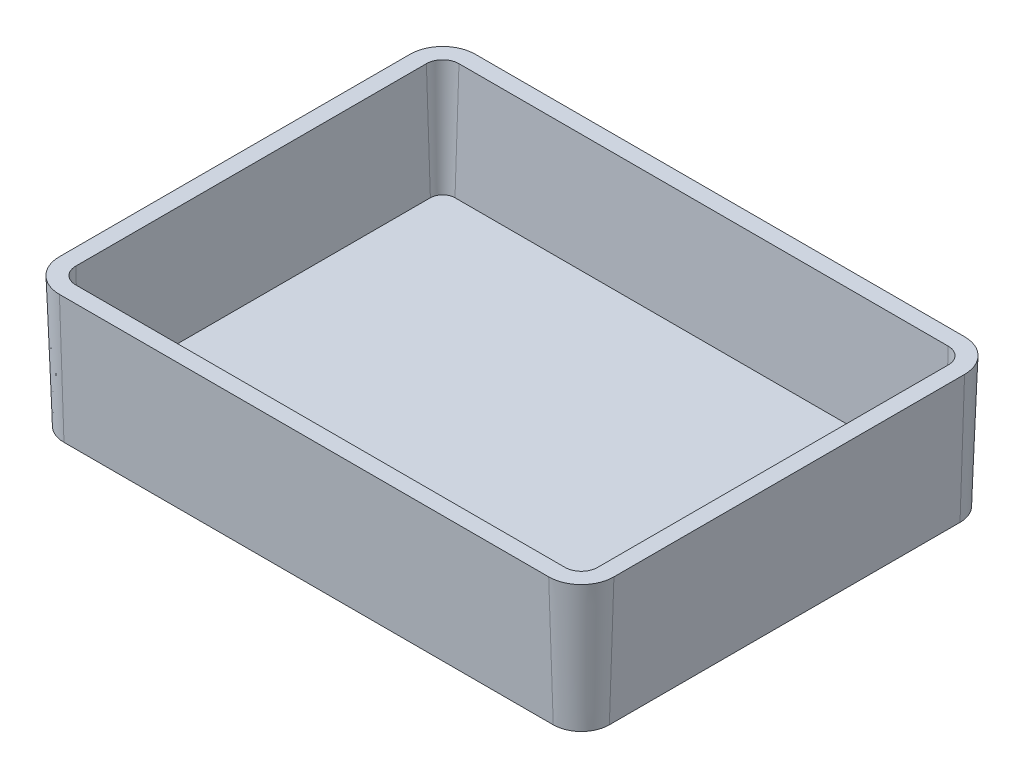
ISO-10303-21;
HEADER;
FILE_DESCRIPTION(('STEP AP214'),'2;1');
FILE_NAME('part.step','',(''),(''),'','','');
FILE_SCHEMA(('AUTOMOTIVE_DESIGN { 1 0 10303 214 1 1 1 1 }'));
ENDSEC;
DATA;
#1=APPLICATION_CONTEXT('core data for automotive mechanical design processes');
#2=APPLICATION_PROTOCOL_DEFINITION('international standard','automotive_design',2000,#1);
#3=PRODUCT_CONTEXT('',#1,'mechanical');
#4=PRODUCT('Part','Part','',(#3));
#5=PRODUCT_RELATED_PRODUCT_CATEGORY('part','',(#4));
#6=PRODUCT_DEFINITION_FORMATION('','',#4);
#7=PRODUCT_DEFINITION_CONTEXT('part definition',#1,'design');
#8=PRODUCT_DEFINITION('design','',#6,#7);
#9=PRODUCT_DEFINITION_SHAPE('','',#8);
#10=(LENGTH_UNIT() NAMED_UNIT(*) SI_UNIT(.MILLI.,.METRE.));
#11=(NAMED_UNIT(*) PLANE_ANGLE_UNIT() SI_UNIT($,.RADIAN.));
#12=(NAMED_UNIT(*) SI_UNIT($,.STERADIAN.) SOLID_ANGLE_UNIT());
#13=UNCERTAINTY_MEASURE_WITH_UNIT(LENGTH_MEASURE(1.E-05),#10,'distance_accuracy_value','');
#14=(GEOMETRIC_REPRESENTATION_CONTEXT(3) GLOBAL_UNCERTAINTY_ASSIGNED_CONTEXT((#13)) GLOBAL_UNIT_ASSIGNED_CONTEXT((#10,
#11,#12)) REPRESENTATION_CONTEXT('',''));
#15=CARTESIAN_POINT('',(0.,0.,0.));
#16=DIRECTION('',(0.,0.,1.));
#17=DIRECTION('',(1.,0.,0.));
#18=AXIS2_PLACEMENT_3D('',#15,#16,#17);
#19=CARTESIAN_POINT('',(-7.5,0.,-5.375));
#20=DIRECTION('',(0.,-1.,0.));
#21=DIRECTION('',(0.,0.,-1.));
#22=AXIS2_PLACEMENT_3D('',#19,#20,#21);
#23=PLANE('',#22);
#24=CARTESIAN_POINT('',(-7.5,0.,-5.375));
#25=DIRECTION('',(0.,1.,0.));
#26=DIRECTION('',(0.,0.,-1.));
#27=AXIS2_PLACEMENT_3D('',#24,#25,#26);
#28=CIRCLE('',#27,1.);
#29=CARTESIAN_POINT('',(-7.5,0.,-6.375));
#30=VERTEX_POINT('',#29);
#31=CARTESIAN_POINT('',(-8.5,0.,-5.37499999999999));
#32=VERTEX_POINT('',#31);
#33=EDGE_CURVE('E175',#30,#32,#28,.T.);
#34=ORIENTED_EDGE('',*,*,#33,.T.);
#35=DIRECTION('',(0.,0.,1.));
#36=VECTOR('',#35,1.);
#37=CARTESIAN_POINT('',(-8.5,0.,5.37499999999999));
#38=LINE('',#37,#36);
#39=CARTESIAN_POINT('',(-8.5,0.,5.37499999999999));
#40=VERTEX_POINT('',#39);
#41=EDGE_CURVE('E240',#32,#40,#38,.T.);
#42=ORIENTED_EDGE('',*,*,#41,.T.);
#43=CARTESIAN_POINT('',(-7.5,0.,5.375));
#44=DIRECTION('',(0.,1.,0.));
#45=DIRECTION('',(0.,0.,-1.));
#46=AXIS2_PLACEMENT_3D('',#43,#44,#45);
#47=CIRCLE('',#46,1.);
#48=CARTESIAN_POINT('',(-7.5,0.,6.375));
#49=VERTEX_POINT('',#48);
#50=EDGE_CURVE('E243',#40,#49,#47,.T.);
#51=ORIENTED_EDGE('',*,*,#50,.T.);
#52=DIRECTION('',(1.,0.,0.));
#53=VECTOR('',#52,1.);
#54=CARTESIAN_POINT('',(-7.5,0.,6.375));
#55=LINE('',#54,#53);
#56=CARTESIAN_POINT('',(7.49999999999999,0.,6.375));
#57=VERTEX_POINT('',#56);
#58=EDGE_CURVE('E246',#49,#57,#55,.T.);
#59=ORIENTED_EDGE('',*,*,#58,.T.);
#60=CARTESIAN_POINT('',(7.5,0.,5.375));
#61=DIRECTION('',(0.,1.,0.));
#62=DIRECTION('',(0.,0.,-1.));
#63=AXIS2_PLACEMENT_3D('',#60,#61,#62);
#64=CIRCLE('',#63,1.);
#65=CARTESIAN_POINT('',(8.5,0.,5.37499999999999));
#66=VERTEX_POINT('',#65);
#67=EDGE_CURVE('E249',#57,#66,#64,.T.);
#68=ORIENTED_EDGE('',*,*,#67,.T.);
#69=DIRECTION('',(0.,0.,-1.));
#70=VECTOR('',#69,1.);
#71=CARTESIAN_POINT('',(8.5,0.,5.37499999999999));
#72=LINE('',#71,#70);
#73=CARTESIAN_POINT('',(8.5,0.,-5.37499999999999));
#74=VERTEX_POINT('',#73);
#75=EDGE_CURVE('E252',#66,#74,#72,.T.);
#76=ORIENTED_EDGE('',*,*,#75,.T.);
#77=CARTESIAN_POINT('',(7.5,0.,-5.375));
#78=DIRECTION('',(0.,1.,0.));
#79=DIRECTION('',(0.,0.,1.));
#80=AXIS2_PLACEMENT_3D('',#77,#78,#79);
#81=CIRCLE('',#80,1.);
#82=CARTESIAN_POINT('',(7.49999999999999,0.,-6.375));
#83=VERTEX_POINT('',#82);
#84=EDGE_CURVE('E255',#74,#83,#81,.T.);
#85=ORIENTED_EDGE('',*,*,#84,.T.);
#86=DIRECTION('',(-1.,0.,0.));
#87=VECTOR('',#86,1.);
#88=CARTESIAN_POINT('',(-7.5,0.,-6.375));
#89=LINE('',#88,#87);
#90=EDGE_CURVE('E257',#83,#30,#89,.T.);
#91=ORIENTED_EDGE('',*,*,#90,.T.);
#92=EDGE_LOOP('',(#34,#42,#51,#59,#68,#76,#85,#91));
#93=FACE_BOUND('',#92,.T.);
#94=CARTESIAN_POINT('',(-7.5,0.,-5.375));
#95=DIRECTION('',(0.,-1.,0.));
#96=DIRECTION('',(0.,0.,-1.));
#97=AXIS2_PLACEMENT_3D('',#94,#95,#96);
#98=CIRCLE('',#97,0.499695227850589);
#99=CARTESIAN_POINT('',(-7.5,0.,-5.87469522785059));
#100=VERTEX_POINT('',#99);
#101=CARTESIAN_POINT('',(-7.99969522785059,0.,-5.375));
#102=VERTEX_POINT('',#101);
#103=EDGE_CURVE('E219',#100,#102,#98,.F.);
#104=ORIENTED_EDGE('',*,*,#103,.F.);
#105=DIRECTION('',(-1.,0.,0.));
#106=VECTOR('',#105,1.);
#107=CARTESIAN_POINT('',(-7.5,0.,-5.87469522785059));
#108=LINE('',#107,#106);
#109=CARTESIAN_POINT('',(7.5,0.,-5.87469522785059));
#110=VERTEX_POINT('',#109);
#111=EDGE_CURVE('E171',#110,#100,#108,.T.);
#112=ORIENTED_EDGE('',*,*,#111,.F.);
#113=CARTESIAN_POINT('',(7.5,0.,-5.375));
#114=DIRECTION('',(0.,-1.,0.));
#115=DIRECTION('',(0.,0.,-1.));
#116=AXIS2_PLACEMENT_3D('',#113,#114,#115);
#117=CIRCLE('',#116,0.499695227850589);
#118=CARTESIAN_POINT('',(7.99969522785059,0.,-5.37499999999999));
#119=VERTEX_POINT('',#118);
#120=EDGE_CURVE('E56',#119,#110,#117,.F.);
#121=ORIENTED_EDGE('',*,*,#120,.F.);
#122=DIRECTION('',(0.,0.,-1.));
#123=VECTOR('',#122,1.);
#124=CARTESIAN_POINT('',(7.99969522785059,0.,5.37499999999999));
#125=LINE('',#124,#123);
#126=CARTESIAN_POINT('',(7.99969522785059,0.,5.375));
#127=VERTEX_POINT('',#126);
#128=EDGE_CURVE('E233',#127,#119,#125,.T.);
#129=ORIENTED_EDGE('',*,*,#128,.F.);
#130=CARTESIAN_POINT('',(7.5,0.,5.375));
#131=DIRECTION('',(0.,-1.,0.));
#132=DIRECTION('',(0.,0.,-1.));
#133=AXIS2_PLACEMENT_3D('',#130,#131,#132);
#134=CIRCLE('',#133,0.499695227850589);
#135=CARTESIAN_POINT('',(7.49999999999999,0.,5.87469522785059));
#136=VERTEX_POINT('',#135);
#137=EDGE_CURVE('E230',#136,#127,#134,.F.);
#138=ORIENTED_EDGE('',*,*,#137,.F.);
#139=DIRECTION('',(1.,0.,0.));
#140=VECTOR('',#139,1.);
#141=CARTESIAN_POINT('',(-7.5,0.,5.87469522785059));
#142=LINE('',#141,#140);
#143=CARTESIAN_POINT('',(-7.5,0.,5.87469522785059));
#144=VERTEX_POINT('',#143);
#145=EDGE_CURVE('E227',#144,#136,#142,.T.);
#146=ORIENTED_EDGE('',*,*,#145,.F.);
#147=CARTESIAN_POINT('',(-7.5,0.,5.375));
#148=DIRECTION('',(0.,-1.,0.));
#149=DIRECTION('',(0.,0.,-1.));
#150=AXIS2_PLACEMENT_3D('',#147,#148,#149);
#151=CIRCLE('',#150,0.499695227850589);
#152=CARTESIAN_POINT('',(-7.99969522785059,0.,5.37499999999999));
#153=VERTEX_POINT('',#152);
#154=EDGE_CURVE('E224',#153,#144,#151,.F.);
#155=ORIENTED_EDGE('',*,*,#154,.F.);
#156=DIRECTION('',(0.,0.,1.));
#157=VECTOR('',#156,1.);
#158=CARTESIAN_POINT('',(-7.99969522785059,0.,5.37499999999999));
#159=LINE('',#158,#157);
#160=EDGE_CURVE('E221',#102,#153,#159,.T.);
#161=ORIENTED_EDGE('',*,*,#160,.F.);
#162=EDGE_LOOP('',(#104,#112,#121,#129,#138,#146,#155,#161));
#163=FACE_BOUND('',#162,.T.);
#164=ADVANCED_FACE('F39',(#93,#163),#23,.F.);
#165=CARTESIAN_POINT('',(-7.5,0.,-5.375));
#166=DIRECTION('',(0.,1.,0.));
#167=DIRECTION('',(0.,0.,-1.));
#168=AXIS2_PLACEMENT_3D('',#165,#166,#167);
#169=CONICAL_SURFACE('',#168,1.,0.0349065850398867);
#170=ORIENTED_EDGE('',*,*,#33,.F.);
#171=DIRECTION('',(0.,0.999390827019096,-0.034899496702501));
#172=VECTOR('',#171,1.);
#173=CARTESIAN_POINT('',(-7.5,0.,-6.375));
#174=LINE('',#173,#172);
#175=CARTESIAN_POINT('',(-7.5,-4.,-6.23531692203301));
#176=VERTEX_POINT('',#175);
#177=EDGE_CURVE('E11',#176,#30,#174,.T.);
#178=ORIENTED_EDGE('',*,*,#177,.F.);
#179=CARTESIAN_POINT('',(-7.5,-4.,-5.375));
#180=DIRECTION('',(0.,-1.,0.));
#181=DIRECTION('',(0.,0.,-1.));
#182=AXIS2_PLACEMENT_3D('',#179,#180,#181);
#183=CIRCLE('',#182,0.860316922033009);
#184=CARTESIAN_POINT('',(-8.36031692203301,-4.,-5.37499999999999));
#185=VERTEX_POINT('',#184);
#186=EDGE_CURVE('E259',#176,#185,#183,.F.);
#187=ORIENTED_EDGE('',*,*,#186,.T.);
#188=DIRECTION('',(-0.034899496702501,0.999390827019096,0.));
#189=VECTOR('',#188,1.);
#190=CARTESIAN_POINT('',(-8.5,0.,-5.37499999999999));
#191=LINE('',#190,#189);
#192=EDGE_CURVE('E91',#185,#32,#191,.T.);
#193=ORIENTED_EDGE('',*,*,#192,.T.);
#194=EDGE_LOOP('',(#170,#178,#187,#193));
#195=FACE_BOUND('',#194,.T.);
#196=ADVANCED_FACE('F296',(#195),#169,.T.);
#197=CARTESIAN_POINT('',(-7.5,0.,-6.375));
#198=DIRECTION('',(0.,-0.034899496702501,-0.999390827019096));
#199=DIRECTION('',(0.,0.999390827019096,-0.034899496702501));
#200=AXIS2_PLACEMENT_3D('',#197,#198,#199);
#201=PLANE('',#200);
#202=ORIENTED_EDGE('',*,*,#90,.F.);
#203=DIRECTION('',(0.,0.999390827019096,-0.034899496702501));
#204=VECTOR('',#203,1.);
#205=CARTESIAN_POINT('',(7.49999999999999,0.,-6.375));
#206=LINE('',#205,#204);
#207=CARTESIAN_POINT('',(7.49999999999999,-4.,-6.23531692203301));
#208=VERTEX_POINT('',#207);
#209=EDGE_CURVE('E48',#208,#83,#206,.T.);
#210=ORIENTED_EDGE('',*,*,#209,.F.);
#211=DIRECTION('',(-1.,0.,0.));
#212=VECTOR('',#211,1.);
#213=CARTESIAN_POINT('',(-7.5,-4.,-6.23531692203301));
#214=LINE('',#213,#212);
#215=EDGE_CURVE('E263',#208,#176,#214,.T.);
#216=ORIENTED_EDGE('',*,*,#215,.T.);
#217=ORIENTED_EDGE('',*,*,#177,.T.);
#218=EDGE_LOOP('',(#202,#210,#216,#217));
#219=FACE_BOUND('',#218,.T.);
#220=ADVANCED_FACE('F41',(#219),#201,.T.);
#221=CARTESIAN_POINT('',(7.5,0.,-5.375));
#222=DIRECTION('',(0.,1.,0.));
#223=DIRECTION('',(0.,0.,1.));
#224=AXIS2_PLACEMENT_3D('',#221,#222,#223);
#225=CONICAL_SURFACE('',#224,1.,0.0349065850398867);
#226=ORIENTED_EDGE('',*,*,#84,.F.);
#227=DIRECTION('',(0.034899496702501,0.999390827019096,0.));
#228=VECTOR('',#227,1.);
#229=CARTESIAN_POINT('',(8.5,0.,-5.37499999999999));
#230=LINE('',#229,#228);
#231=CARTESIAN_POINT('',(8.36031692203301,-4.,-5.37499999999999));
#232=VERTEX_POINT('',#231);
#233=EDGE_CURVE('E271',#232,#74,#230,.T.);
#234=ORIENTED_EDGE('',*,*,#233,.F.);
#235=CARTESIAN_POINT('',(7.5,-4.,-5.375));
#236=DIRECTION('',(0.,-1.,0.));
#237=DIRECTION('',(0.,0.,-1.));
#238=AXIS2_PLACEMENT_3D('',#235,#236,#237);
#239=CIRCLE('',#238,0.860316922033009);
#240=EDGE_CURVE('E276',#232,#208,#239,.F.);
#241=ORIENTED_EDGE('',*,*,#240,.T.);
#242=ORIENTED_EDGE('',*,*,#209,.T.);
#243=EDGE_LOOP('',(#226,#234,#241,#242));
#244=FACE_BOUND('',#243,.T.);
#245=ADVANCED_FACE('F300',(#244),#225,.T.);
#246=CARTESIAN_POINT('',(8.5,0.,5.37499999999999));
#247=DIRECTION('',(0.999390827019096,-0.034899496702501,0.));
#248=DIRECTION('',(0.034899496702501,0.999390827019096,0.));
#249=AXIS2_PLACEMENT_3D('',#246,#247,#248);
#250=PLANE('',#249);
#251=ORIENTED_EDGE('',*,*,#75,.F.);
#252=DIRECTION('',(0.034899496702501,0.999390827019096,0.));
#253=VECTOR('',#252,1.);
#254=CARTESIAN_POINT('',(8.5,0.,5.37499999999999));
#255=LINE('',#254,#253);
#256=CARTESIAN_POINT('',(8.36031692203301,-4.,5.37499999999999));
#257=VERTEX_POINT('',#256);
#258=EDGE_CURVE('E269',#257,#66,#255,.T.);
#259=ORIENTED_EDGE('',*,*,#258,.F.);
#260=DIRECTION('',(0.,0.,-1.));
#261=VECTOR('',#260,1.);
#262=CARTESIAN_POINT('',(8.36031692203301,-4.,5.37499999999999));
#263=LINE('',#262,#261);
#264=EDGE_CURVE('E278',#257,#232,#263,.T.);
#265=ORIENTED_EDGE('',*,*,#264,.T.);
#266=ORIENTED_EDGE('',*,*,#233,.T.);
#267=EDGE_LOOP('',(#251,#259,#265,#266));
#268=FACE_BOUND('',#267,.T.);
#269=ADVANCED_FACE('F305',(#268),#250,.T.);
#270=CARTESIAN_POINT('',(7.5,0.,5.375));
#271=DIRECTION('',(0.,1.,0.));
#272=DIRECTION('',(0.,0.,-1.));
#273=AXIS2_PLACEMENT_3D('',#270,#271,#272);
#274=CONICAL_SURFACE('',#273,1.,0.0349065850398867);
#275=ORIENTED_EDGE('',*,*,#67,.F.);
#276=DIRECTION('',(0.,0.999390827019096,0.034899496702501));
#277=VECTOR('',#276,1.);
#278=CARTESIAN_POINT('',(7.49999999999999,0.,6.375));
#279=LINE('',#278,#277);
#280=CARTESIAN_POINT('',(7.49999999999999,-4.,6.23531692203301));
#281=VERTEX_POINT('',#280);
#282=EDGE_CURVE('E267',#281,#57,#279,.T.);
#283=ORIENTED_EDGE('',*,*,#282,.F.);
#284=CARTESIAN_POINT('',(7.5,-4.,5.375));
#285=DIRECTION('',(0.,-1.,0.));
#286=DIRECTION('',(0.,0.,-1.));
#287=AXIS2_PLACEMENT_3D('',#284,#285,#286);
#288=CIRCLE('',#287,0.860316922033009);
#289=EDGE_CURVE('E281',#281,#257,#288,.F.);
#290=ORIENTED_EDGE('',*,*,#289,.T.);
#291=ORIENTED_EDGE('',*,*,#258,.T.);
#292=EDGE_LOOP('',(#275,#283,#290,#291));
#293=FACE_BOUND('',#292,.T.);
#294=ADVANCED_FACE('F308',(#293),#274,.T.);
#295=CARTESIAN_POINT('',(-7.5,0.,6.375));
#296=DIRECTION('',(0.,-0.034899496702501,0.999390827019096));
#297=DIRECTION('',(0.,-0.999390827019096,-0.034899496702501));
#298=AXIS2_PLACEMENT_3D('',#295,#296,#297);
#299=PLANE('',#298);
#300=ORIENTED_EDGE('',*,*,#58,.F.);
#301=DIRECTION('',(0.,0.999390827019096,0.034899496702501));
#302=VECTOR('',#301,1.);
#303=CARTESIAN_POINT('',(-7.5,0.,6.375));
#304=LINE('',#303,#302);
#305=CARTESIAN_POINT('',(-7.5,-4.,6.23531692203301));
#306=VERTEX_POINT('',#305);
#307=EDGE_CURVE('E265',#306,#49,#304,.T.);
#308=ORIENTED_EDGE('',*,*,#307,.F.);
#309=DIRECTION('',(1.,0.,0.));
#310=VECTOR('',#309,1.);
#311=CARTESIAN_POINT('',(-7.5,-4.,6.23531692203301));
#312=LINE('',#311,#310);
#313=EDGE_CURVE('E284',#306,#281,#312,.T.);
#314=ORIENTED_EDGE('',*,*,#313,.T.);
#315=ORIENTED_EDGE('',*,*,#282,.T.);
#316=EDGE_LOOP('',(#300,#308,#314,#315));
#317=FACE_BOUND('',#316,.T.);
#318=ADVANCED_FACE('F311',(#317),#299,.T.);
#319=CARTESIAN_POINT('',(-7.5,0.,5.375));
#320=DIRECTION('',(0.,1.,0.));
#321=DIRECTION('',(0.,0.,-1.));
#322=AXIS2_PLACEMENT_3D('',#319,#320,#321);
#323=CONICAL_SURFACE('',#322,1.,0.0349065850398867);
#324=ORIENTED_EDGE('',*,*,#50,.F.);
#325=DIRECTION('',(-0.034899496702501,0.999390827019096,0.));
#326=VECTOR('',#325,1.);
#327=CARTESIAN_POINT('',(-8.5,0.,5.37499999999999));
#328=LINE('',#327,#326);
#329=CARTESIAN_POINT('',(-8.36031692203301,-4.,5.37499999999999));
#330=VERTEX_POINT('',#329);
#331=EDGE_CURVE('E262',#330,#40,#328,.T.);
#332=ORIENTED_EDGE('',*,*,#331,.F.);
#333=CARTESIAN_POINT('',(-7.5,-4.,5.375));
#334=DIRECTION('',(0.,-1.,0.));
#335=DIRECTION('',(0.,0.,-1.));
#336=AXIS2_PLACEMENT_3D('',#333,#334,#335);
#337=CIRCLE('',#336,0.860316922033009);
#338=EDGE_CURVE('E286',#330,#306,#337,.F.);
#339=ORIENTED_EDGE('',*,*,#338,.T.);
#340=ORIENTED_EDGE('',*,*,#307,.T.);
#341=EDGE_LOOP('',(#324,#332,#339,#340));
#342=FACE_BOUND('',#341,.T.);
#343=ADVANCED_FACE('F312',(#342),#323,.T.);
#344=CARTESIAN_POINT('',(-8.5,0.,5.37499999999999));
#345=DIRECTION('',(-0.999390827019096,-0.034899496702501,0.));
#346=DIRECTION('',(0.034899496702501,-0.999390827019096,0.));
#347=AXIS2_PLACEMENT_3D('',#344,#345,#346);
#348=PLANE('',#347);
#349=ORIENTED_EDGE('',*,*,#41,.F.);
#350=ORIENTED_EDGE('',*,*,#192,.F.);
#351=DIRECTION('',(0.,0.,1.));
#352=VECTOR('',#351,1.);
#353=CARTESIAN_POINT('',(-8.36031692203301,-4.,5.37499999999999));
#354=LINE('',#353,#352);
#355=EDGE_CURVE('E43',#185,#330,#354,.T.);
#356=ORIENTED_EDGE('',*,*,#355,.T.);
#357=ORIENTED_EDGE('',*,*,#331,.T.);
#358=EDGE_LOOP('',(#349,#350,#356,#357));
#359=FACE_BOUND('',#358,.T.);
#360=ADVANCED_FACE('F290',(#359),#348,.T.);
#361=CARTESIAN_POINT('',(-7.5,-4.,-5.375));
#362=DIRECTION('',(0.,-1.,0.));
#363=DIRECTION('',(0.,0.,-1.));
#364=AXIS2_PLACEMENT_3D('',#361,#362,#363);
#365=PLANE('',#364);
#366=ORIENTED_EDGE('',*,*,#186,.F.);
#367=ORIENTED_EDGE('',*,*,#215,.F.);
#368=ORIENTED_EDGE('',*,*,#240,.F.);
#369=ORIENTED_EDGE('',*,*,#264,.F.);
#370=ORIENTED_EDGE('',*,*,#289,.F.);
#371=ORIENTED_EDGE('',*,*,#313,.F.);
#372=ORIENTED_EDGE('',*,*,#338,.F.);
#373=ORIENTED_EDGE('',*,*,#355,.F.);
#374=EDGE_LOOP('',(#366,#367,#368,#369,#370,#371,#372,#373));
#375=FACE_BOUND('',#374,.T.);
#376=ADVANCED_FACE('F293',(#375),#365,.T.);
#377=CARTESIAN_POINT('',(-7.5,0.0174497483512505,-5.375));
#378=DIRECTION('',(0.,1.,0.));
#379=DIRECTION('',(0.,0.,-1.));
#380=AXIS2_PLACEMENT_3D('',#377,#378,#379);
#381=CONICAL_SURFACE('',#380,0.500304586490452,0.0349065850398867);
#382=ORIENTED_EDGE('',*,*,#103,.T.);
#383=DIRECTION('',(-0.034899496702501,0.999390827019096,0.));
#384=VECTOR('',#383,1.);
#385=CARTESIAN_POINT('',(-8.00030458649045,0.0174497483512505,-5.375));
#386=LINE('',#385,#384);
#387=CARTESIAN_POINT('',(-7.87747253462947,-3.5,-5.375));
#388=VERTEX_POINT('',#387);
#389=EDGE_CURVE('E181',#388,#102,#386,.T.);
#390=ORIENTED_EDGE('',*,*,#389,.F.);
#391=CARTESIAN_POINT('',(-7.5,-3.5,-5.375));
#392=DIRECTION('',(0.,-1.,0.));
#393=DIRECTION('',(0.,0.,-1.));
#394=AXIS2_PLACEMENT_3D('',#391,#392,#393);
#395=CIRCLE('',#394,0.377472534629472);
#396=CARTESIAN_POINT('',(-7.5,-3.5,-5.75247253462947));
#397=VERTEX_POINT('',#396);
#398=EDGE_CURVE('E179',#397,#388,#395,.F.);
#399=ORIENTED_EDGE('',*,*,#398,.F.);
#400=DIRECTION('',(0.,0.999390827019096,-0.034899496702501));
#401=VECTOR('',#400,1.);
#402=CARTESIAN_POINT('',(-7.5,0.0174497483512505,-5.87530458649045));
#403=LINE('',#402,#401);
#404=EDGE_CURVE('E165',#397,#100,#403,.T.);
#405=ORIENTED_EDGE('',*,*,#404,.T.);
#406=EDGE_LOOP('',(#382,#390,#399,#405));
#407=FACE_BOUND('',#406,.T.);
#408=ADVANCED_FACE('F180',(#407),#381,.F.);
#409=CARTESIAN_POINT('',(-7.5,0.0174497483512505,-5.87530458649045));
#410=DIRECTION('',(0.,-0.034899496702501,-0.999390827019096));
#411=DIRECTION('',(0.,0.999390827019096,-0.034899496702501));
#412=AXIS2_PLACEMENT_3D('',#409,#410,#411);
#413=PLANE('',#412);
#414=ORIENTED_EDGE('',*,*,#111,.T.);
#415=ORIENTED_EDGE('',*,*,#404,.F.);
#416=DIRECTION('',(-1.,0.,0.));
#417=VECTOR('',#416,1.);
#418=CARTESIAN_POINT('',(-7.5,-3.5,-5.75247253462947));
#419=LINE('',#418,#417);
#420=CARTESIAN_POINT('',(7.5,-3.5,-5.75247253462947));
#421=VERTEX_POINT('',#420);
#422=EDGE_CURVE('E169',#421,#397,#419,.T.);
#423=ORIENTED_EDGE('',*,*,#422,.F.);
#424=DIRECTION('',(0.,0.999390827019096,-0.034899496702501));
#425=VECTOR('',#424,1.);
#426=CARTESIAN_POINT('',(7.5,0.0174497483512505,-5.87530458649045));
#427=LINE('',#426,#425);
#428=EDGE_CURVE('E176',#421,#110,#427,.T.);
#429=ORIENTED_EDGE('',*,*,#428,.T.);
#430=EDGE_LOOP('',(#414,#415,#423,#429));
#431=FACE_BOUND('',#430,.T.);
#432=ADVANCED_FACE('F167',(#431),#413,.F.);
#433=CARTESIAN_POINT('',(7.5,0.0174497483512505,-5.375));
#434=DIRECTION('',(0.,1.,0.));
#435=DIRECTION('',(0.,0.,1.));
#436=AXIS2_PLACEMENT_3D('',#433,#434,#435);
#437=CONICAL_SURFACE('',#436,0.500304586490452,0.0349065850398867);
#438=ORIENTED_EDGE('',*,*,#120,.T.);
#439=ORIENTED_EDGE('',*,*,#428,.F.);
#440=CARTESIAN_POINT('',(7.5,-3.5,-5.375));
#441=DIRECTION('',(0.,-1.,0.));
#442=DIRECTION('',(0.,0.,-1.));
#443=AXIS2_PLACEMENT_3D('',#440,#441,#442);
#444=CIRCLE('',#443,0.377472534629472);
#445=CARTESIAN_POINT('',(7.87747253462947,-3.5,-5.37499999999999));
#446=VERTEX_POINT('',#445);
#447=EDGE_CURVE('E191',#446,#421,#444,.F.);
#448=ORIENTED_EDGE('',*,*,#447,.F.);
#449=DIRECTION('',(0.034899496702501,0.999390827019096,0.));
#450=VECTOR('',#449,1.);
#451=CARTESIAN_POINT('',(8.00030458649045,0.0174497483512505,-5.37499999999999));
#452=LINE('',#451,#450);
#453=EDGE_CURVE('E199',#446,#119,#452,.T.);
#454=ORIENTED_EDGE('',*,*,#453,.T.);
#455=EDGE_LOOP('',(#438,#439,#448,#454));
#456=FACE_BOUND('',#455,.T.);
#457=ADVANCED_FACE('F351',(#456),#437,.F.);
#458=CARTESIAN_POINT('',(8.00030458649045,0.0174497483512505,5.37499999999999));
#459=DIRECTION('',(0.999390827019096,-0.034899496702501,0.));
#460=DIRECTION('',(0.034899496702501,0.999390827019096,0.));
#461=AXIS2_PLACEMENT_3D('',#458,#459,#460);
#462=PLANE('',#461);
#463=ORIENTED_EDGE('',*,*,#128,.T.);
#464=ORIENTED_EDGE('',*,*,#453,.F.);
#465=DIRECTION('',(0.,0.,-1.));
#466=VECTOR('',#465,1.);
#467=CARTESIAN_POINT('',(7.87747253462947,-3.5,5.37499999999999));
#468=LINE('',#467,#466);
#469=CARTESIAN_POINT('',(7.87747253462947,-3.5,5.375));
#470=VERTEX_POINT('',#469);
#471=EDGE_CURVE('E195',#470,#446,#468,.T.);
#472=ORIENTED_EDGE('',*,*,#471,.F.);
#473=DIRECTION('',(0.034899496702501,0.999390827019096,0.));
#474=VECTOR('',#473,1.);
#475=CARTESIAN_POINT('',(8.00030458649045,0.0174497483512505,5.375));
#476=LINE('',#475,#474);
#477=EDGE_CURVE('E200',#470,#127,#476,.T.);
#478=ORIENTED_EDGE('',*,*,#477,.T.);
#479=EDGE_LOOP('',(#463,#464,#472,#478));
#480=FACE_BOUND('',#479,.T.);
#481=ADVANCED_FACE('F347',(#480),#462,.F.);
#482=CARTESIAN_POINT('',(7.5,0.0174497483512505,5.375));
#483=DIRECTION('',(0.,1.,0.));
#484=DIRECTION('',(0.,0.,-1.));
#485=AXIS2_PLACEMENT_3D('',#482,#483,#484);
#486=CONICAL_SURFACE('',#485,0.500304586490452,0.0349065850398867);
#487=ORIENTED_EDGE('',*,*,#137,.T.);
#488=ORIENTED_EDGE('',*,*,#477,.F.);
#489=CARTESIAN_POINT('',(7.5,-3.5,5.375));
#490=DIRECTION('',(0.,-1.,0.));
#491=DIRECTION('',(0.,0.,-1.));
#492=AXIS2_PLACEMENT_3D('',#489,#490,#491);
#493=CIRCLE('',#492,0.377472534629472);
#494=CARTESIAN_POINT('',(7.49999999999999,-3.5,5.75247253462947));
#495=VERTEX_POINT('',#494);
#496=EDGE_CURVE('E205',#495,#470,#493,.F.);
#497=ORIENTED_EDGE('',*,*,#496,.F.);
#498=DIRECTION('',(0.,-0.999390827019096,-0.034899496702501));
#499=VECTOR('',#498,1.);
#500=CARTESIAN_POINT('',(7.49999999999999,0.0174497483512505,5.87530458649045));
#501=LINE('',#500,#499);
#502=EDGE_CURVE('E203',#495,#136,#501,.F.);
#503=ORIENTED_EDGE('',*,*,#502,.T.);
#504=EDGE_LOOP('',(#487,#488,#497,#503));
#505=FACE_BOUND('',#504,.T.);
#506=ADVANCED_FACE('F343',(#505),#486,.F.);
#507=CARTESIAN_POINT('',(-7.5,0.0174497483512505,5.87530458649045));
#508=DIRECTION('',(0.,-0.034899496702501,0.999390827019096));
#509=DIRECTION('',(0.,-0.999390827019096,-0.034899496702501));
#510=AXIS2_PLACEMENT_3D('',#507,#508,#509);
#511=PLANE('',#510);
#512=ORIENTED_EDGE('',*,*,#145,.T.);
#513=ORIENTED_EDGE('',*,*,#502,.F.);
#514=DIRECTION('',(1.,0.,0.));
#515=VECTOR('',#514,1.);
#516=CARTESIAN_POINT('',(-7.5,-3.5,5.75247253462947));
#517=LINE('',#516,#515);
#518=CARTESIAN_POINT('',(-7.5,-3.5,5.75247253462947));
#519=VERTEX_POINT('',#518);
#520=EDGE_CURVE('E210',#519,#495,#517,.T.);
#521=ORIENTED_EDGE('',*,*,#520,.F.);
#522=DIRECTION('',(0.,0.999390827019096,0.034899496702501));
#523=VECTOR('',#522,1.);
#524=CARTESIAN_POINT('',(-7.5,0.0174497483512505,5.87530458649045));
#525=LINE('',#524,#523);
#526=EDGE_CURVE('E207',#519,#144,#525,.T.);
#527=ORIENTED_EDGE('',*,*,#526,.T.);
#528=EDGE_LOOP('',(#512,#513,#521,#527));
#529=FACE_BOUND('',#528,.T.);
#530=ADVANCED_FACE('F339',(#529),#511,.F.);
#531=CARTESIAN_POINT('',(-7.5,0.0174497483512505,5.375));
#532=DIRECTION('',(0.,1.,0.));
#533=DIRECTION('',(0.,0.,-1.));
#534=AXIS2_PLACEMENT_3D('',#531,#532,#533);
#535=CONICAL_SURFACE('',#534,0.500304586490452,0.0349065850398867);
#536=ORIENTED_EDGE('',*,*,#154,.T.);
#537=ORIENTED_EDGE('',*,*,#526,.F.);
#538=CARTESIAN_POINT('',(-7.5,-3.5,5.375));
#539=DIRECTION('',(0.,-1.,0.));
#540=DIRECTION('',(0.,0.,-1.));
#541=AXIS2_PLACEMENT_3D('',#538,#539,#540);
#542=CIRCLE('',#541,0.377472534629472);
#543=CARTESIAN_POINT('',(-7.87747253462947,-3.5,5.37499999999999));
#544=VERTEX_POINT('',#543);
#545=EDGE_CURVE('E214',#544,#519,#542,.F.);
#546=ORIENTED_EDGE('',*,*,#545,.F.);
#547=DIRECTION('',(0.034899496702501,-0.999390827019096,0.));
#548=VECTOR('',#547,1.);
#549=CARTESIAN_POINT('',(-8.00030458649045,0.0174497483512505,5.37499999999999));
#550=LINE('',#549,#548);
#551=EDGE_CURVE('E193',#544,#153,#550,.F.);
#552=ORIENTED_EDGE('',*,*,#551,.T.);
#553=EDGE_LOOP('',(#536,#537,#546,#552));
#554=FACE_BOUND('',#553,.T.);
#555=ADVANCED_FACE('F335',(#554),#535,.F.);
#556=CARTESIAN_POINT('',(-8.00030458649045,0.0174497483512505,5.37499999999999));
#557=DIRECTION('',(-0.999390827019096,-0.034899496702501,0.));
#558=DIRECTION('',(0.034899496702501,-0.999390827019096,0.));
#559=AXIS2_PLACEMENT_3D('',#556,#557,#558);
#560=PLANE('',#559);
#561=ORIENTED_EDGE('',*,*,#160,.T.);
#562=ORIENTED_EDGE('',*,*,#551,.F.);
#563=DIRECTION('',(0.,0.,1.));
#564=VECTOR('',#563,1.);
#565=CARTESIAN_POINT('',(-7.87747253462947,-3.5,5.37499999999999));
#566=LINE('',#565,#564);
#567=EDGE_CURVE('E185',#388,#544,#566,.T.);
#568=ORIENTED_EDGE('',*,*,#567,.F.);
#569=ORIENTED_EDGE('',*,*,#389,.T.);
#570=EDGE_LOOP('',(#561,#562,#568,#569));
#571=FACE_BOUND('',#570,.T.);
#572=ADVANCED_FACE('F332',(#571),#560,.F.);
#573=CARTESIAN_POINT('',(-7.5,-3.5,-5.375));
#574=DIRECTION('',(0.,-1.,0.));
#575=DIRECTION('',(0.,0.,-1.));
#576=AXIS2_PLACEMENT_3D('',#573,#574,#575);
#577=PLANE('',#576);
#578=ORIENTED_EDGE('',*,*,#398,.T.);
#579=ORIENTED_EDGE('',*,*,#567,.T.);
#580=ORIENTED_EDGE('',*,*,#545,.T.);
#581=ORIENTED_EDGE('',*,*,#520,.T.);
#582=ORIENTED_EDGE('',*,*,#496,.T.);
#583=ORIENTED_EDGE('',*,*,#471,.T.);
#584=ORIENTED_EDGE('',*,*,#447,.T.);
#585=ORIENTED_EDGE('',*,*,#422,.T.);
#586=EDGE_LOOP('',(#578,#579,#580,#581,#582,#583,#584,#585));
#587=FACE_BOUND('',#586,.T.);
#588=ADVANCED_FACE('F188',(#587),#577,.F.);
#589=CLOSED_SHELL('',(#164,#196,#220,#245,#269,#294,#318,#343,#360,#376,#408,#432,#457,#481,
#506,#530,#555,#572,#588));
#590=MANIFOLD_SOLID_BREP('B2',#589);
#591=ADVANCED_BREP_SHAPE_REPRESENTATION('',(#18,#590),#14);
#592=SHAPE_DEFINITION_REPRESENTATION(#9,#591);
ENDSEC;
END-ISO-10303-21;
